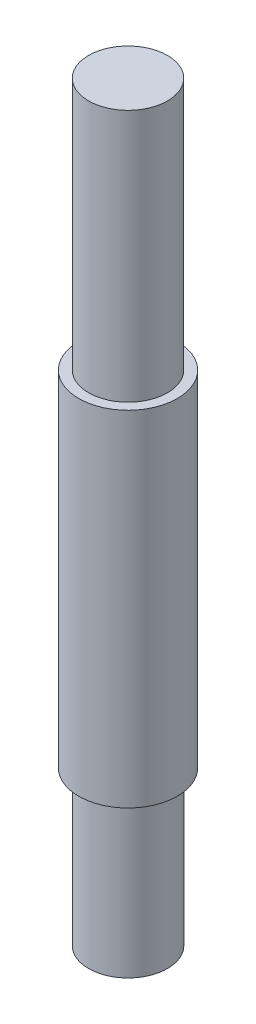
ISO-10303-21;
HEADER;
FILE_DESCRIPTION(('STEP AP214'),'2;1');
FILE_NAME('part.step','',(''),(''),'','','');
FILE_SCHEMA(('AUTOMOTIVE_DESIGN { 1 0 10303 214 1 1 1 1 }'));
ENDSEC;
DATA;
#1=APPLICATION_CONTEXT('core data for automotive mechanical design processes');
#2=APPLICATION_PROTOCOL_DEFINITION('international standard','automotive_design',2000,#1);
#3=PRODUCT_CONTEXT('',#1,'mechanical');
#4=PRODUCT('Part','Part','',(#3));
#5=PRODUCT_RELATED_PRODUCT_CATEGORY('part','',(#4));
#6=PRODUCT_DEFINITION_FORMATION('','',#4);
#7=PRODUCT_DEFINITION_CONTEXT('part definition',#1,'design');
#8=PRODUCT_DEFINITION('design','',#6,#7);
#9=PRODUCT_DEFINITION_SHAPE('','',#8);
#10=(LENGTH_UNIT() NAMED_UNIT(*) SI_UNIT(.MILLI.,.METRE.));
#11=(NAMED_UNIT(*) PLANE_ANGLE_UNIT() SI_UNIT($,.RADIAN.));
#12=(NAMED_UNIT(*) SI_UNIT($,.STERADIAN.) SOLID_ANGLE_UNIT());
#13=UNCERTAINTY_MEASURE_WITH_UNIT(LENGTH_MEASURE(1.E-05),#10,'distance_accuracy_value','');
#14=(GEOMETRIC_REPRESENTATION_CONTEXT(3) GLOBAL_UNCERTAINTY_ASSIGNED_CONTEXT((#13)) GLOBAL_UNIT_ASSIGNED_CONTEXT((#10,
#11,#12)) REPRESENTATION_CONTEXT('',''));
#15=CARTESIAN_POINT('',(0.,0.,0.));
#16=DIRECTION('',(0.,0.,1.));
#17=DIRECTION('',(1.,0.,0.));
#18=AXIS2_PLACEMENT_3D('',#15,#16,#17);
#19=CARTESIAN_POINT('',(0.,60.58,0.));
#20=DIRECTION('',(0.,1.,0.));
#21=DIRECTION('',(0.,0.,1.));
#22=AXIS2_PLACEMENT_3D('',#19,#20,#21);
#23=PLANE('',#22);
#24=CARTESIAN_POINT('',(0.,60.58,0.));
#25=DIRECTION('',(0.,-1.,0.));
#26=DIRECTION('',(0.,0.,-1.));
#27=AXIS2_PLACEMENT_3D('',#24,#25,#26);
#28=CIRCLE('',#27,4.);
#29=CARTESIAN_POINT('',(0.,60.58,-4.));
#30=VERTEX_POINT('',#29);
#31=EDGE_CURVE('E18',#30,#30,#28,.T.);
#32=ORIENTED_EDGE('',*,*,#31,.F.);
#33=EDGE_LOOP('',(#32));
#34=FACE_BOUND('',#33,.T.);
#35=ADVANCED_FACE('F15',(#34),#23,.T.);
#36=CARTESIAN_POINT('',(0.,-15.64,0.));
#37=DIRECTION('',(0.,-1.,0.));
#38=DIRECTION('',(0.,0.,-1.));
#39=AXIS2_PLACEMENT_3D('',#36,#37,#38);
#40=PLANE('',#39);
#41=CARTESIAN_POINT('',(0.,-15.64,0.));
#42=DIRECTION('',(0.,1.,0.));
#43=DIRECTION('',(0.,0.,1.));
#44=AXIS2_PLACEMENT_3D('',#41,#42,#43);
#45=CIRCLE('',#44,4.);
#46=CARTESIAN_POINT('',(0.,-15.64,4.));
#47=VERTEX_POINT('',#46);
#48=EDGE_CURVE('E40',#47,#47,#45,.T.);
#49=ORIENTED_EDGE('',*,*,#48,.F.);
#50=EDGE_LOOP('',(#49));
#51=FACE_BOUND('',#50,.T.);
#52=ADVANCED_FACE('F51',(#51),#40,.T.);
#53=CARTESIAN_POINT('',(0.,60.58,0.));
#54=DIRECTION('',(0.,-1.,0.));
#55=DIRECTION('',(0.,0.,-1.));
#56=AXIS2_PLACEMENT_3D('',#53,#54,#55);
#57=CYLINDRICAL_SURFACE('',#56,4.);
#58=CARTESIAN_POINT('',(0.,34.94,0.));
#59=DIRECTION('',(0.,-1.,0.));
#60=DIRECTION('',(0.,0.,-1.));
#61=AXIS2_PLACEMENT_3D('',#58,#59,#60);
#62=CIRCLE('',#61,4.);
#63=CARTESIAN_POINT('',(0.,34.94,-4.));
#64=VERTEX_POINT('',#63);
#65=EDGE_CURVE('E37',#64,#64,#62,.T.);
#66=ORIENTED_EDGE('',*,*,#65,.F.);
#67=EDGE_LOOP('',(#66));
#68=FACE_BOUND('',#67,.T.);
#69=ORIENTED_EDGE('',*,*,#31,.T.);
#70=EDGE_LOOP('',(#69));
#71=FACE_BOUND('',#70,.T.);
#72=ADVANCED_FACE('F48',(#68,#71),#57,.T.);
#73=CARTESIAN_POINT('',(0.,-15.64,0.));
#74=DIRECTION('',(0.,1.,0.));
#75=DIRECTION('',(0.,0.,1.));
#76=AXIS2_PLACEMENT_3D('',#73,#74,#75);
#77=CYLINDRICAL_SURFACE('',#76,4.);
#78=ORIENTED_EDGE('',*,*,#48,.T.);
#79=EDGE_LOOP('',(#78));
#80=FACE_BOUND('',#79,.T.);
#81=CARTESIAN_POINT('',(0.,0.,0.));
#82=DIRECTION('',(0.,1.,0.));
#83=DIRECTION('',(0.,0.,1.));
#84=AXIS2_PLACEMENT_3D('',#81,#82,#83);
#85=CIRCLE('',#84,4.);
#86=CARTESIAN_POINT('',(0.,0.,4.));
#87=VERTEX_POINT('',#86);
#88=EDGE_CURVE('E32',#87,#87,#85,.F.);
#89=ORIENTED_EDGE('',*,*,#88,.T.);
#90=EDGE_LOOP('',(#89));
#91=FACE_BOUND('',#90,.T.);
#92=ADVANCED_FACE('F71',(#80,#91),#77,.T.);
#93=CARTESIAN_POINT('',(0.,34.94,0.));
#94=DIRECTION('',(0.,1.,0.));
#95=DIRECTION('',(0.,0.,1.));
#96=AXIS2_PLACEMENT_3D('',#93,#94,#95);
#97=PLANE('',#96);
#98=CARTESIAN_POINT('',(0.,34.94,0.));
#99=DIRECTION('',(0.,-1.,0.));
#100=DIRECTION('',(0.,0.,-1.));
#101=AXIS2_PLACEMENT_3D('',#98,#99,#100);
#102=CIRCLE('',#101,5.);
#103=CARTESIAN_POINT('',(0.,34.94,-5.));
#104=VERTEX_POINT('',#103);
#105=EDGE_CURVE('E23',#104,#104,#102,.T.);
#106=ORIENTED_EDGE('',*,*,#105,.F.);
#107=EDGE_LOOP('',(#106));
#108=FACE_BOUND('',#107,.T.);
#109=ORIENTED_EDGE('',*,*,#65,.T.);
#110=EDGE_LOOP('',(#109));
#111=FACE_BOUND('',#110,.T.);
#112=ADVANCED_FACE('F64',(#108,#111),#97,.T.);
#113=CARTESIAN_POINT('',(0.,0.,0.));
#114=DIRECTION('',(0.,1.,0.));
#115=DIRECTION('',(0.,0.,1.));
#116=AXIS2_PLACEMENT_3D('',#113,#114,#115);
#117=PLANE('',#116);
#118=CARTESIAN_POINT('',(0.,0.,0.));
#119=DIRECTION('',(0.,-1.,0.));
#120=DIRECTION('',(0.,0.,-1.));
#121=AXIS2_PLACEMENT_3D('',#118,#119,#120);
#122=CIRCLE('',#121,5.);
#123=CARTESIAN_POINT('',(0.,0.,-5.));
#124=VERTEX_POINT('',#123);
#125=EDGE_CURVE('E10',#124,#124,#122,.F.);
#126=ORIENTED_EDGE('',*,*,#125,.F.);
#127=EDGE_LOOP('',(#126));
#128=FACE_BOUND('',#127,.T.);
#129=ORIENTED_EDGE('',*,*,#88,.F.);
#130=EDGE_LOOP('',(#129));
#131=FACE_BOUND('',#130,.T.);
#132=ADVANCED_FACE('F59',(#128,#131),#117,.F.);
#133=CARTESIAN_POINT('',(0.,34.94,0.));
#134=DIRECTION('',(0.,-1.,0.));
#135=DIRECTION('',(0.,0.,-1.));
#136=AXIS2_PLACEMENT_3D('',#133,#134,#135);
#137=CYLINDRICAL_SURFACE('',#136,5.);
#138=ORIENTED_EDGE('',*,*,#125,.T.);
#139=EDGE_LOOP('',(#138));
#140=FACE_BOUND('',#139,.T.);
#141=ORIENTED_EDGE('',*,*,#105,.T.);
#142=EDGE_LOOP('',(#141));
#143=FACE_BOUND('',#142,.T.);
#144=ADVANCED_FACE('F57',(#140,#143),#137,.T.);
#145=CLOSED_SHELL('',(#35,#52,#72,#92,#112,#132,#144));
#146=MANIFOLD_SOLID_BREP('B1',#145);
#147=ADVANCED_BREP_SHAPE_REPRESENTATION('',(#18,#146),#14);
#148=SHAPE_DEFINITION_REPRESENTATION(#9,#147);
ENDSEC;
END-ISO-10303-21;
